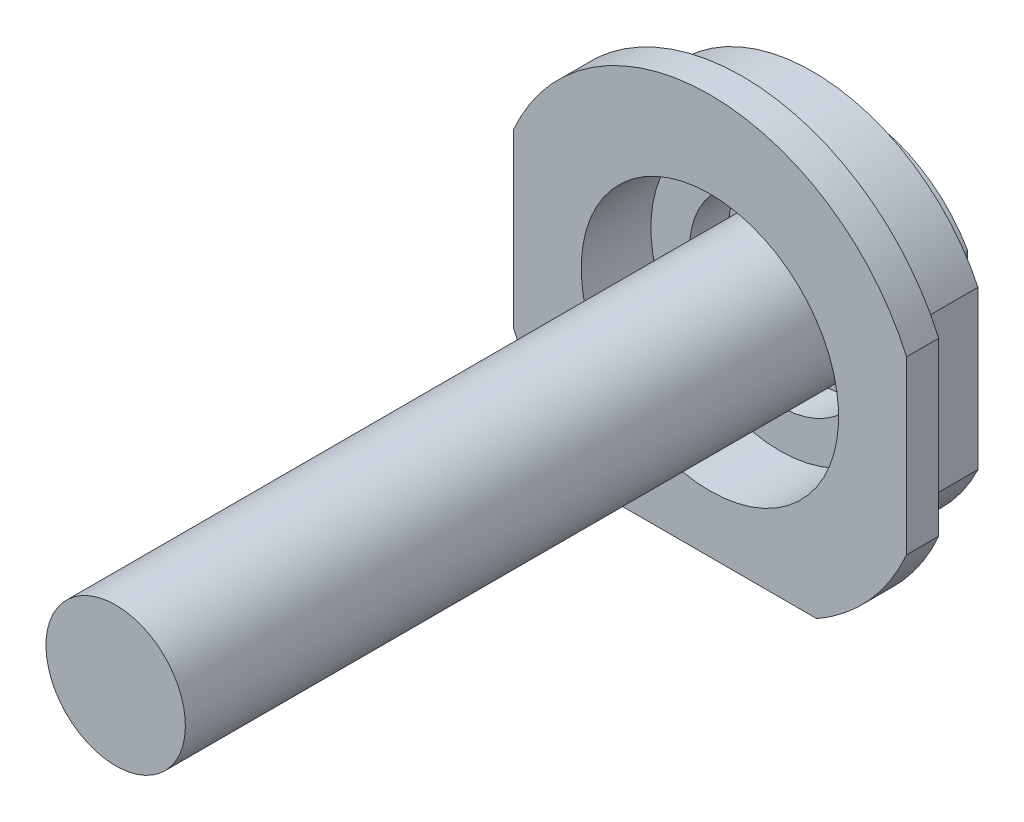
ISO-10303-21;
HEADER;
FILE_DESCRIPTION(('STEP AP214'),'2;1');
FILE_NAME('part.step','',(''),(''),'','','');
FILE_SCHEMA(('AUTOMOTIVE_DESIGN { 1 0 10303 214 1 1 1 1 }'));
ENDSEC;
DATA;
#1=APPLICATION_CONTEXT('core data for automotive mechanical design processes');
#2=APPLICATION_PROTOCOL_DEFINITION('international standard','automotive_design',2000,#1);
#3=PRODUCT_CONTEXT('',#1,'mechanical');
#4=PRODUCT('Part','Part','',(#3));
#5=PRODUCT_RELATED_PRODUCT_CATEGORY('part','',(#4));
#6=PRODUCT_DEFINITION_FORMATION('','',#4);
#7=PRODUCT_DEFINITION_CONTEXT('part definition',#1,'design');
#8=PRODUCT_DEFINITION('design','',#6,#7);
#9=PRODUCT_DEFINITION_SHAPE('','',#8);
#10=(LENGTH_UNIT() NAMED_UNIT(*) SI_UNIT(.MILLI.,.METRE.));
#11=(NAMED_UNIT(*) PLANE_ANGLE_UNIT() SI_UNIT($,.RADIAN.));
#12=(NAMED_UNIT(*) SI_UNIT($,.STERADIAN.) SOLID_ANGLE_UNIT());
#13=UNCERTAINTY_MEASURE_WITH_UNIT(LENGTH_MEASURE(1.E-05),#10,'distance_accuracy_value','');
#14=(GEOMETRIC_REPRESENTATION_CONTEXT(3) GLOBAL_UNCERTAINTY_ASSIGNED_CONTEXT((#13)) GLOBAL_UNIT_ASSIGNED_CONTEXT((#10,
#11,#12)) REPRESENTATION_CONTEXT('',''));
#15=CARTESIAN_POINT('',(0.,0.,0.));
#16=DIRECTION('',(0.,0.,1.));
#17=DIRECTION('',(1.,0.,0.));
#18=AXIS2_PLACEMENT_3D('',#15,#16,#17);
#19=CARTESIAN_POINT('',(620.2391212457,0.,514.5));
#20=DIRECTION('',(0.,0.,1.));
#21=DIRECTION('',(0.,1.,0.));
#22=AXIS2_PLACEMENT_3D('',#19,#20,#21);
#23=PLANE('',#22);
#24=CARTESIAN_POINT('',(625.,0.,514.499999999686));
#25=DIRECTION('',(0.,0.,1.));
#26=DIRECTION('',(0.,1.,0.));
#27=AXIS2_PLACEMENT_3D('',#24,#25,#26);
#28=CIRCLE('',#27,72.5);
#29=CARTESIAN_POINT('',(687.99999999966,35.8782664024179,514.499999999686));
#30=VERTEX_POINT('',#29);
#31=CARTESIAN_POINT('',(687.99999999966,-35.8782664024181,514.499999999686));
#32=VERTEX_POINT('',#31);
#33=EDGE_CURVE('E274',#30,#32,#28,.T.);
#34=ORIENTED_EDGE('',*,*,#33,.F.);
#35=DIRECTION('',(0.,1.,0.));
#36=VECTOR('',#35,1.);
#37=CARTESIAN_POINT('',(688.,-1.00475183728577E-11,514.5));
#38=LINE('',#37,#36);
#39=EDGE_CURVE('E270',#32,#30,#38,.T.);
#40=ORIENTED_EDGE('',*,*,#39,.F.);
#41=EDGE_LOOP('',(#34,#40));
#42=FACE_BOUND('',#41,.T.);
#43=CARTESIAN_POINT('',(625.,0.,514.499999999686));
#44=DIRECTION('',(0.,0.,1.));
#45=DIRECTION('',(0.,1.,0.));
#46=AXIS2_PLACEMENT_3D('',#43,#44,#45);
#47=CIRCLE('',#46,60.5);
#48=CARTESIAN_POINT('',(625.,60.4999999999999,514.499999999686));
#49=VERTEX_POINT('',#48);
#50=EDGE_CURVE('E11',#49,#49,#47,.F.);
#51=ORIENTED_EDGE('',*,*,#50,.F.);
#52=EDGE_LOOP('',(#51));
#53=FACE_BOUND('',#52,.T.);
#54=ADVANCED_FACE('F18',(#42,#53),#23,.F.);
#55=CARTESIAN_POINT('',(692.7975,-1.00475183728577E-11,520.866497531727));
#56=DIRECTION('',(-0.798635510047432,0.,0.601815023151864));
#57=DIRECTION('',(0.601815023151864,0.,0.798635510047432));
#58=AXIS2_PLACEMENT_3D('',#55,#56,#57);
#59=PLANE('',#58);
#60=ORIENTED_EDGE('',*,*,#39,.T.);
#61=CARTESIAN_POINT('',(625.,0.,430.896176238464));
#62=DIRECTION('',(-0.798635510047432,0.,0.601815023151864));
#63=DIRECTION('',(0.601815023151864,0.,0.798635510047432));
#64=AXIS2_PLACEMENT_3D('',#61,#62,#63);
#65=ELLIPSE('',#64,120.468910231417,72.5);
#66=EDGE_CURVE('E37',#30,#32,#65,.F.);
#67=ORIENTED_EDGE('',*,*,#66,.T.);
#68=EDGE_LOOP('',(#60,#67));
#69=FACE_BOUND('',#68,.T.);
#70=ADVANCED_FACE('F304',(#69),#59,.F.);
#71=CARTESIAN_POINT('',(624.999999998898,1.10211839654539E-09,-5999485.5));
#72=DIRECTION('',(0.,0.,1.));
#73=DIRECTION('',(0.,1.,0.));
#74=AXIS2_PLACEMENT_3D('',#71,#72,#73);
#75=CYLINDRICAL_SURFACE('',#74,72.5);
#76=ORIENTED_EDGE('',*,*,#66,.F.);
#77=ORIENTED_EDGE('',*,*,#33,.T.);
#78=EDGE_LOOP('',(#76,#77));
#79=FACE_BOUND('',#78,.T.);
#80=CARTESIAN_POINT('',(625.,0.,537.999999999926));
#81=DIRECTION('',(0.,0.,1.));
#82=DIRECTION('',(0.,1.,0.));
#83=AXIS2_PLACEMENT_3D('',#80,#81,#82);
#84=CIRCLE('',#83,72.5);
#85=CARTESIAN_POINT('',(625.,72.4999999999999,537.999999999926));
#86=VERTEX_POINT('',#85);
#87=EDGE_CURVE('E166',#86,#86,#84,.T.);
#88=ORIENTED_EDGE('',*,*,#87,.F.);
#89=EDGE_LOOP('',(#88));
#90=FACE_BOUND('',#89,.T.);
#91=ADVANCED_FACE('F298',(#79,#90),#75,.T.);
#92=CARTESIAN_POINT('',(625.,0.,534.5));
#93=DIRECTION('',(0.,0.,1.));
#94=DIRECTION('',(0.,1.,0.));
#95=AXIS2_PLACEMENT_3D('',#92,#93,#94);
#96=PLANE('',#95);
#97=CARTESIAN_POINT('',(625.,0.,534.500000000123));
#98=DIRECTION('',(0.,0.,1.));
#99=DIRECTION('',(0.,1.,0.));
#100=AXIS2_PLACEMENT_3D('',#97,#98,#99);
#101=CIRCLE('',#100,50.5);
#102=CARTESIAN_POINT('',(625.,50.5,534.500000000123));
#103=VERTEX_POINT('',#102);
#104=EDGE_CURVE('E281',#103,#103,#101,.F.);
#105=ORIENTED_EDGE('',*,*,#104,.F.);
#106=EDGE_LOOP('',(#105));
#107=FACE_BOUND('',#106,.T.);
#108=CARTESIAN_POINT('',(625.,0.,534.500000000123));
#109=DIRECTION('',(0.,0.,1.));
#110=DIRECTION('',(0.,1.,0.));
#111=AXIS2_PLACEMENT_3D('',#108,#109,#110);
#112=CIRCLE('',#111,43.25);
#113=CARTESIAN_POINT('',(625.,43.2499999999999,534.500000000123));
#114=VERTEX_POINT('',#113);
#115=EDGE_CURVE('E277',#114,#114,#112,.T.);
#116=ORIENTED_EDGE('',*,*,#115,.F.);
#117=EDGE_LOOP('',(#116));
#118=FACE_BOUND('',#117,.T.);
#119=ADVANCED_FACE('F294',(#107,#118),#96,.T.);
#120=CARTESIAN_POINT('',(624.999999998898,1.10210451875758E-09,-5999489.5));
#121=DIRECTION('',(0.,0.,1.));
#122=DIRECTION('',(0.,1.,0.));
#123=AXIS2_PLACEMENT_3D('',#120,#121,#122);
#124=CYLINDRICAL_SURFACE('',#123,43.25);
#125=CARTESIAN_POINT('',(625.,0.,515.49999999989));
#126=DIRECTION('',(0.,0.,1.));
#127=DIRECTION('',(0.,1.,0.));
#128=AXIS2_PLACEMENT_3D('',#125,#126,#127);
#129=CIRCLE('',#128,43.25);
#130=CARTESIAN_POINT('',(625.,43.2499999999999,515.49999999989));
#131=VERTEX_POINT('',#130);
#132=EDGE_CURVE('E28',#131,#131,#129,.T.);
#133=ORIENTED_EDGE('',*,*,#132,.F.);
#134=EDGE_LOOP('',(#133));
#135=FACE_BOUND('',#134,.T.);
#136=ORIENTED_EDGE('',*,*,#115,.T.);
#137=EDGE_LOOP('',(#136));
#138=FACE_BOUND('',#137,.T.);
#139=ADVANCED_FACE('F20',(#135,#138),#124,.F.);
#140=CARTESIAN_POINT('',(625.000000001102,-1.10222941884785E-09,6000577.5));
#141=DIRECTION('',(0.,0.,-1.));
#142=DIRECTION('',(0.,-1.,0.));
#143=AXIS2_PLACEMENT_3D('',#140,#141,#142);
#144=CYLINDRICAL_SURFACE('',#143,102.5);
#145=DIRECTION('',(0.,0.,-1.));
#146=VECTOR('',#145,1.);
#147=CARTESIAN_POINT('',(532.5,-44.1588043316391,577.5));
#148=LINE('',#147,#146);
#149=CARTESIAN_POINT('',(532.5,-44.1588043316391,577.499999999894));
#150=VERTEX_POINT('',#149);
#151=CARTESIAN_POINT('',(532.5,-44.1588043316396,537.999999999963));
#152=VERTEX_POINT('',#151);
#153=EDGE_CURVE('E150',#150,#152,#148,.T.);
#154=ORIENTED_EDGE('',*,*,#153,.T.);
#155=CARTESIAN_POINT('',(625.,0.,537.999999999926));
#156=DIRECTION('',(0.,0.,1.));
#157=DIRECTION('',(0.,1.,0.));
#158=AXIS2_PLACEMENT_3D('',#155,#156,#157);
#159=CIRCLE('',#158,102.5);
#160=CARTESIAN_POINT('',(717.5,-44.1588043316397,537.999999999945));
#161=VERTEX_POINT('',#160);
#162=EDGE_CURVE('E143',#161,#152,#159,.F.);
#163=ORIENTED_EDGE('',*,*,#162,.F.);
#164=DIRECTION('',(0.,0.,-1.));
#165=VECTOR('',#164,1.);
#166=CARTESIAN_POINT('',(717.5,-44.1588043316392,556.5));
#167=LINE('',#166,#165);
#168=CARTESIAN_POINT('',(717.5,-44.1588043316392,577.499999999894));
#169=VERTEX_POINT('',#168);
#170=EDGE_CURVE('E125',#161,#169,#167,.F.);
#171=ORIENTED_EDGE('',*,*,#170,.T.);
#172=CARTESIAN_POINT('',(625.,0.,577.499999999788));
#173=DIRECTION('',(0.,0.,-1.));
#174=DIRECTION('',(0.,-1.,0.));
#175=AXIS2_PLACEMENT_3D('',#172,#173,#174);
#176=CIRCLE('',#175,102.5);
#177=EDGE_CURVE('E188',#150,#169,#176,.F.);
#178=ORIENTED_EDGE('',*,*,#177,.F.);
#179=EDGE_LOOP('',(#154,#163,#171,#178));
#180=FACE_BOUND('',#179,.T.);
#181=ADVANCED_FACE('F149',(#180),#144,.T.);
#182=CARTESIAN_POINT('',(532.5,-2.00395255944841E-11,567.));
#183=DIRECTION('',(1.,0.,0.));
#184=DIRECTION('',(0.,1.,0.));
#185=AXIS2_PLACEMENT_3D('',#182,#183,#184);
#186=PLANE('',#185);
#187=DIRECTION('',(0.,-1.,0.));
#188=VECTOR('',#187,1.);
#189=CARTESIAN_POINT('',(532.5,9.12000000686793,577.5));
#190=LINE('',#189,#188);
#191=CARTESIAN_POINT('',(532.5,44.1588043316586,577.499999999894));
#192=VERTEX_POINT('',#191);
#193=EDGE_CURVE('E184',#192,#150,#190,.T.);
#194=ORIENTED_EDGE('',*,*,#193,.F.);
#195=DIRECTION('',(0.,0.,1.));
#196=VECTOR('',#195,1.);
#197=CARTESIAN_POINT('',(532.5,44.1588043316782,567.));
#198=LINE('',#197,#196);
#199=CARTESIAN_POINT('',(532.5,44.1588043316232,537.999999999963));
#200=VERTEX_POINT('',#199);
#201=EDGE_CURVE('E136',#192,#200,#198,.F.);
#202=ORIENTED_EDGE('',*,*,#201,.T.);
#203=DIRECTION('',(0.,-1.,0.));
#204=VECTOR('',#203,1.);
#205=CARTESIAN_POINT('',(532.5,-2.00395255944841E-11,538.));
#206=LINE('',#205,#204);
#207=EDGE_CURVE('E163',#200,#152,#206,.T.);
#208=ORIENTED_EDGE('',*,*,#207,.T.);
#209=ORIENTED_EDGE('',*,*,#153,.F.);
#210=EDGE_LOOP('',(#194,#202,#208,#209));
#211=FACE_BOUND('',#210,.T.);
#212=ADVANCED_FACE('F357',(#211),#186,.F.);
#213=CARTESIAN_POINT('',(625.000000001102,-1.10222941884785E-09,6000577.5));
#214=DIRECTION('',(0.,0.,-1.));
#215=DIRECTION('',(0.,-1.,0.));
#216=AXIS2_PLACEMENT_3D('',#213,#214,#215);
#217=CYLINDRICAL_SURFACE('',#216,102.5);
#218=ORIENTED_EDGE('',*,*,#201,.F.);
#219=CARTESIAN_POINT('',(625.,0.,577.499999999788));
#220=DIRECTION('',(0.,0.,-1.));
#221=DIRECTION('',(0.,-1.,0.));
#222=AXIS2_PLACEMENT_3D('',#219,#220,#221);
#223=CIRCLE('',#222,102.5);
#224=CARTESIAN_POINT('',(717.5,44.1588043316391,577.499999999894));
#225=VERTEX_POINT('',#224);
#226=EDGE_CURVE('E187',#225,#192,#223,.F.);
#227=ORIENTED_EDGE('',*,*,#226,.F.);
#228=DIRECTION('',(0.,0.,-1.));
#229=VECTOR('',#228,1.);
#230=CARTESIAN_POINT('',(717.5,44.1588043316391,577.5));
#231=LINE('',#230,#229);
#232=CARTESIAN_POINT('',(717.5,44.1588043316492,537.999999999963));
#233=VERTEX_POINT('',#232);
#234=EDGE_CURVE('E135',#225,#233,#231,.T.);
#235=ORIENTED_EDGE('',*,*,#234,.T.);
#236=CARTESIAN_POINT('',(625.,0.,537.999999999926));
#237=DIRECTION('',(0.,0.,1.));
#238=DIRECTION('',(0.,1.,0.));
#239=AXIS2_PLACEMENT_3D('',#236,#237,#238);
#240=CIRCLE('',#239,102.5);
#241=EDGE_CURVE('E146',#200,#233,#240,.F.);
#242=ORIENTED_EDGE('',*,*,#241,.F.);
#243=EDGE_LOOP('',(#218,#227,#235,#242));
#244=FACE_BOUND('',#243,.T.);
#245=ADVANCED_FACE('F354',(#244),#217,.T.);
#246=CARTESIAN_POINT('',(717.5,-2.00811589579075E-11,567.));
#247=DIRECTION('',(-1.,0.,0.));
#248=DIRECTION('',(0.,-1.,0.));
#249=AXIS2_PLACEMENT_3D('',#246,#247,#248);
#250=PLANE('',#249);
#251=DIRECTION('',(0.,-1.,0.));
#252=VECTOR('',#251,1.);
#253=CARTESIAN_POINT('',(717.5,9.12000000686791,577.5));
#254=LINE('',#253,#252);
#255=EDGE_CURVE('E130',#169,#225,#254,.F.);
#256=ORIENTED_EDGE('',*,*,#255,.F.);
#257=ORIENTED_EDGE('',*,*,#170,.F.);
#258=DIRECTION('',(0.,1.,0.));
#259=VECTOR('',#258,1.);
#260=CARTESIAN_POINT('',(717.5,0.000224821004951581,538.));
#261=LINE('',#260,#259);
#262=EDGE_CURVE('E128',#233,#161,#261,.F.);
#263=ORIENTED_EDGE('',*,*,#262,.F.);
#264=ORIENTED_EDGE('',*,*,#234,.F.);
#265=EDGE_LOOP('',(#256,#257,#263,#264));
#266=FACE_BOUND('',#265,.T.);
#267=ADVANCED_FACE('F127',(#266),#250,.F.);
#268=CARTESIAN_POINT('',(625.,9.12000000686791,577.5));
#269=DIRECTION('',(0.,0.,-1.));
#270=DIRECTION('',(0.,-1.,0.));
#271=AXIS2_PLACEMENT_3D('',#268,#269,#270);
#272=PLANE('',#271);
#273=ORIENTED_EDGE('',*,*,#255,.T.);
#274=ORIENTED_EDGE('',*,*,#226,.T.);
#275=ORIENTED_EDGE('',*,*,#193,.T.);
#276=ORIENTED_EDGE('',*,*,#177,.T.);
#277=EDGE_LOOP('',(#273,#274,#275,#276));
#278=FACE_BOUND('',#277,.T.);
#279=CARTESIAN_POINT('',(625.,0.,577.499999999788));
#280=DIRECTION('',(0.,0.,-1.));
#281=DIRECTION('',(0.,-1.,0.));
#282=AXIS2_PLACEMENT_3D('',#279,#280,#281);
#283=CIRCLE('',#282,120.);
#284=CARTESIAN_POINT('',(515.,47.9583152331157,577.499999999894));
#285=VERTEX_POINT('',#284);
#286=CARTESIAN_POINT('',(735.,47.9583152331158,577.499999999894));
#287=VERTEX_POINT('',#286);
#288=EDGE_CURVE('E233',#285,#287,#283,.T.);
#289=ORIENTED_EDGE('',*,*,#288,.T.);
#290=DIRECTION('',(0.,1.,0.));
#291=VECTOR('',#290,1.);
#292=CARTESIAN_POINT('',(735.,-1.50712775592865E-11,577.5));
#293=LINE('',#292,#291);
#294=CARTESIAN_POINT('',(735.,-47.9583152331286,577.499999999894));
#295=VERTEX_POINT('',#294);
#296=EDGE_CURVE('E192',#295,#287,#293,.T.);
#297=ORIENTED_EDGE('',*,*,#296,.F.);
#298=CARTESIAN_POINT('',(625.,0.,577.499999999788));
#299=DIRECTION('',(0.,0.,-1.));
#300=DIRECTION('',(0.,-1.,0.));
#301=AXIS2_PLACEMENT_3D('',#298,#299,#300);
#302=CIRCLE('',#301,120.);
#303=CARTESIAN_POINT('',(684.866518188382,-104.,577.499999999841));
#304=VERTEX_POINT('',#303);
#305=EDGE_CURVE('E201',#295,#304,#302,.T.);
#306=ORIENTED_EDGE('',*,*,#305,.T.);
#307=DIRECTION('',(-1.,0.,0.));
#308=VECTOR('',#307,1.);
#309=CARTESIAN_POINT('',(625.,-104.,577.5));
#310=LINE('',#309,#308);
#311=CARTESIAN_POINT('',(565.13348181163,-104.,577.499999999894));
#312=VERTEX_POINT('',#311);
#313=EDGE_CURVE('E208',#304,#312,#310,.T.);
#314=ORIENTED_EDGE('',*,*,#313,.T.);
#315=CARTESIAN_POINT('',(625.,0.,577.499999999788));
#316=DIRECTION('',(0.,0.,-1.));
#317=DIRECTION('',(0.,-1.,0.));
#318=AXIS2_PLACEMENT_3D('',#315,#316,#317);
#319=CIRCLE('',#318,120.);
#320=CARTESIAN_POINT('',(515.,-47.9583152331285,577.499999999841));
#321=VERTEX_POINT('',#320);
#322=EDGE_CURVE('E218',#312,#321,#319,.T.);
#323=ORIENTED_EDGE('',*,*,#322,.T.);
#324=DIRECTION('',(0.,-1.,0.));
#325=VECTOR('',#324,1.);
#326=CARTESIAN_POINT('',(515.,9.12000000686793,577.5));
#327=LINE('',#326,#325);
#328=EDGE_CURVE('E222',#321,#285,#327,.F.);
#329=ORIENTED_EDGE('',*,*,#328,.T.);
#330=EDGE_LOOP('',(#289,#297,#306,#314,#323,#329));
#331=FACE_BOUND('',#330,.T.);
#332=ADVANCED_FACE('F347',(#278,#331),#272,.T.);
#333=CARTESIAN_POINT('',(735.,-1.50712775592865E-11,586.5));
#334=DIRECTION('',(1.,0.,0.));
#335=DIRECTION('',(0.,1.,0.));
#336=AXIS2_PLACEMENT_3D('',#333,#334,#335);
#337=PLANE('',#336);
#338=DIRECTION('',(0.,0.,1.));
#339=VECTOR('',#338,1.);
#340=CARTESIAN_POINT('',(735.,47.9583152331043,586.5));
#341=LINE('',#340,#339);
#342=CARTESIAN_POINT('',(735.,47.9583152331158,595.499999999909));
#343=VERTEX_POINT('',#342);
#344=EDGE_CURVE('E225',#287,#343,#341,.T.);
#345=ORIENTED_EDGE('',*,*,#344,.T.);
#346=DIRECTION('',(0.,1.,0.));
#347=VECTOR('',#346,1.);
#348=CARTESIAN_POINT('',(735.,-1.50712775592865E-11,595.5));
#349=LINE('',#348,#347);
#350=CARTESIAN_POINT('',(735.,-47.9583152331286,595.499999999909));
#351=VERTEX_POINT('',#350);
#352=EDGE_CURVE('E240',#343,#351,#349,.F.);
#353=ORIENTED_EDGE('',*,*,#352,.T.);
#354=DIRECTION('',(0.,0.,1.));
#355=VECTOR('',#354,1.);
#356=CARTESIAN_POINT('',(735.,-47.9583152331297,586.5));
#357=LINE('',#356,#355);
#358=EDGE_CURVE('E200',#351,#295,#357,.F.);
#359=ORIENTED_EDGE('',*,*,#358,.T.);
#360=ORIENTED_EDGE('',*,*,#296,.T.);
#361=EDGE_LOOP('',(#345,#353,#359,#360));
#362=FACE_BOUND('',#361,.T.);
#363=ADVANCED_FACE('F343',(#362),#337,.T.);
#364=CARTESIAN_POINT('',(625.000000001102,-1.10225717442347E-09,6000595.5));
#365=DIRECTION('',(0.,0.,-1.));
#366=DIRECTION('',(0.,-1.,0.));
#367=AXIS2_PLACEMENT_3D('',#364,#365,#366);
#368=CYLINDRICAL_SURFACE('',#367,120.);
#369=DIRECTION('',(0.,0.,-1.));
#370=VECTOR('',#369,1.);
#371=CARTESIAN_POINT('',(684.866518189483,-104.000000001104,6000595.5));
#372=LINE('',#371,#370);
#373=CARTESIAN_POINT('',(684.866518188382,-104.,595.499999999863));
#374=VERTEX_POINT('',#373);
#375=EDGE_CURVE('E204',#374,#304,#372,.T.);
#376=ORIENTED_EDGE('',*,*,#375,.T.);
#377=ORIENTED_EDGE('',*,*,#305,.F.);
#378=ORIENTED_EDGE('',*,*,#358,.F.);
#379=CARTESIAN_POINT('',(625.,0.,595.499999999817));
#380=DIRECTION('',(0.,0.,-1.));
#381=DIRECTION('',(0.,-1.,0.));
#382=AXIS2_PLACEMENT_3D('',#379,#380,#381);
#383=CIRCLE('',#382,120.);
#384=EDGE_CURVE('E258',#351,#374,#383,.T.);
#385=ORIENTED_EDGE('',*,*,#384,.T.);
#386=EDGE_LOOP('',(#376,#377,#378,#385));
#387=FACE_BOUND('',#386,.T.);
#388=ADVANCED_FACE('F339',(#387),#368,.T.);
#389=CARTESIAN_POINT('',(624.99999999999,-104.,586.5));
#390=DIRECTION('',(0.,1.,0.));
#391=DIRECTION('',(-1.,0.,0.));
#392=AXIS2_PLACEMENT_3D('',#389,#390,#391);
#393=PLANE('',#392);
#394=ORIENTED_EDGE('',*,*,#313,.F.);
#395=ORIENTED_EDGE('',*,*,#375,.F.);
#396=DIRECTION('',(-1.,0.,0.));
#397=VECTOR('',#396,1.);
#398=CARTESIAN_POINT('',(624.99999999999,-104.,595.5));
#399=LINE('',#398,#397);
#400=CARTESIAN_POINT('',(565.13348181163,-104.,595.499999999909));
#401=VERTEX_POINT('',#400);
#402=EDGE_CURVE('E254',#374,#401,#399,.T.);
#403=ORIENTED_EDGE('',*,*,#402,.T.);
#404=DIRECTION('',(0.,0.,1.));
#405=VECTOR('',#404,1.);
#406=CARTESIAN_POINT('',(565.133481811644,-104.,586.5));
#407=LINE('',#406,#405);
#408=EDGE_CURVE('E211',#401,#312,#407,.F.);
#409=ORIENTED_EDGE('',*,*,#408,.T.);
#410=EDGE_LOOP('',(#394,#395,#403,#409));
#411=FACE_BOUND('',#410,.T.);
#412=ADVANCED_FACE('F335',(#411),#393,.F.);
#413=CARTESIAN_POINT('',(625.000000001102,-1.10225717442347E-09,6000595.5));
#414=DIRECTION('',(0.,0.,-1.));
#415=DIRECTION('',(0.,-1.,0.));
#416=AXIS2_PLACEMENT_3D('',#413,#414,#415);
#417=CYLINDRICAL_SURFACE('',#416,120.);
#418=ORIENTED_EDGE('',*,*,#408,.F.);
#419=CARTESIAN_POINT('',(625.,0.,595.499999999817));
#420=DIRECTION('',(0.,0.,-1.));
#421=DIRECTION('',(0.,-1.,0.));
#422=AXIS2_PLACEMENT_3D('',#419,#420,#421);
#423=CIRCLE('',#422,120.);
#424=CARTESIAN_POINT('',(515.,-47.9583152331285,595.499999999863));
#425=VERTEX_POINT('',#424);
#426=EDGE_CURVE('E250',#401,#425,#423,.T.);
#427=ORIENTED_EDGE('',*,*,#426,.T.);
#428=DIRECTION('',(0.,0.,-1.));
#429=VECTOR('',#428,1.);
#430=CARTESIAN_POINT('',(515.000000001103,-47.9583152342318,6000595.5));
#431=LINE('',#430,#429);
#432=EDGE_CURVE('E221',#425,#321,#431,.T.);
#433=ORIENTED_EDGE('',*,*,#432,.T.);
#434=ORIENTED_EDGE('',*,*,#322,.F.);
#435=EDGE_LOOP('',(#418,#427,#433,#434));
#436=FACE_BOUND('',#435,.T.);
#437=ADVANCED_FACE('F331',(#436),#417,.T.);
#438=CARTESIAN_POINT('',(515.,-1.50573997714787E-11,586.5));
#439=DIRECTION('',(1.,0.,0.));
#440=DIRECTION('',(0.,1.,0.));
#441=AXIS2_PLACEMENT_3D('',#438,#439,#440);
#442=PLANE('',#441);
#443=ORIENTED_EDGE('',*,*,#328,.F.);
#444=ORIENTED_EDGE('',*,*,#432,.F.);
#445=DIRECTION('',(0.,1.,0.));
#446=VECTOR('',#445,1.);
#447=CARTESIAN_POINT('',(515.,-1.50573997714787E-11,595.5));
#448=LINE('',#447,#446);
#449=CARTESIAN_POINT('',(515.,47.9583152331157,595.499999999909));
#450=VERTEX_POINT('',#449);
#451=EDGE_CURVE('E246',#425,#450,#448,.T.);
#452=ORIENTED_EDGE('',*,*,#451,.T.);
#453=DIRECTION('',(0.,0.,1.));
#454=VECTOR('',#453,1.);
#455=CARTESIAN_POINT('',(515.,47.9583152331043,586.5));
#456=LINE('',#455,#454);
#457=EDGE_CURVE('E229',#450,#285,#456,.F.);
#458=ORIENTED_EDGE('',*,*,#457,.T.);
#459=EDGE_LOOP('',(#443,#444,#452,#458));
#460=FACE_BOUND('',#459,.T.);
#461=ADVANCED_FACE('F327',(#460),#442,.F.);
#462=CARTESIAN_POINT('',(625.000000001102,-1.10225717442347E-09,6000595.5));
#463=DIRECTION('',(0.,0.,-1.));
#464=DIRECTION('',(0.,-1.,0.));
#465=AXIS2_PLACEMENT_3D('',#462,#463,#464);
#466=CYLINDRICAL_SURFACE('',#465,120.);
#467=ORIENTED_EDGE('',*,*,#457,.F.);
#468=CARTESIAN_POINT('',(625.,0.,595.499999999817));
#469=DIRECTION('',(0.,0.,-1.));
#470=DIRECTION('',(0.,-1.,0.));
#471=AXIS2_PLACEMENT_3D('',#468,#469,#470);
#472=CIRCLE('',#471,120.);
#473=EDGE_CURVE('E245',#450,#343,#472,.T.);
#474=ORIENTED_EDGE('',*,*,#473,.T.);
#475=ORIENTED_EDGE('',*,*,#344,.F.);
#476=ORIENTED_EDGE('',*,*,#288,.F.);
#477=EDGE_LOOP('',(#467,#474,#475,#476));
#478=FACE_BOUND('',#477,.T.);
#479=ADVANCED_FACE('F323',(#478),#466,.T.);
#480=CARTESIAN_POINT('',(625.000000001102,-1.10224329663566E-09,6000595.5));
#481=DIRECTION('',(0.,0.,-1.));
#482=DIRECTION('',(0.,-1.,0.));
#483=AXIS2_PLACEMENT_3D('',#480,#481,#482);
#484=CYLINDRICAL_SURFACE('',#483,72.);
#485=CARTESIAN_POINT('',(625.,0.,556.500000000057));
#486=DIRECTION('',(0.,0.,1.));
#487=DIRECTION('',(0.,1.,0.));
#488=AXIS2_PLACEMENT_3D('',#485,#486,#487);
#489=CIRCLE('',#488,72.);
#490=CARTESIAN_POINT('',(625.,71.9999999999999,556.500000000057));
#491=VERTEX_POINT('',#490);
#492=EDGE_CURVE('E174',#491,#491,#489,.T.);
#493=ORIENTED_EDGE('',*,*,#492,.F.);
#494=EDGE_LOOP('',(#493));
#495=FACE_BOUND('',#494,.T.);
#496=CARTESIAN_POINT('',(625.,0.,595.499999999817));
#497=DIRECTION('',(0.,0.,-1.));
#498=DIRECTION('',(0.,-1.,0.));
#499=AXIS2_PLACEMENT_3D('',#496,#497,#498);
#500=CIRCLE('',#499,72.);
#501=CARTESIAN_POINT('',(625.,-72.0000000000001,595.499999999817));
#502=VERTEX_POINT('',#501);
#503=EDGE_CURVE('E241',#502,#502,#500,.F.);
#504=ORIENTED_EDGE('',*,*,#503,.T.);
#505=EDGE_LOOP('',(#504));
#506=FACE_BOUND('',#505,.T.);
#507=ADVANCED_FACE('F319',(#495,#506),#484,.F.);
#508=CARTESIAN_POINT('',(625.,9.12000000666593,595.5));
#509=DIRECTION('',(0.,0.,-1.));
#510=DIRECTION('',(0.,-1.,0.));
#511=AXIS2_PLACEMENT_3D('',#508,#509,#510);
#512=PLANE('',#511);
#513=ORIENTED_EDGE('',*,*,#503,.F.);
#514=EDGE_LOOP('',(#513));
#515=FACE_BOUND('',#514,.T.);
#516=ORIENTED_EDGE('',*,*,#451,.F.);
#517=ORIENTED_EDGE('',*,*,#426,.F.);
#518=ORIENTED_EDGE('',*,*,#402,.F.);
#519=ORIENTED_EDGE('',*,*,#384,.F.);
#520=ORIENTED_EDGE('',*,*,#352,.F.);
#521=ORIENTED_EDGE('',*,*,#473,.F.);
#522=EDGE_LOOP('',(#516,#517,#518,#519,#520,#521));
#523=FACE_BOUND('',#522,.T.);
#524=ADVANCED_FACE('F314',(#515,#523),#512,.F.);
#525=CARTESIAN_POINT('',(625.,0.000224821004951581,538.));
#526=DIRECTION('',(0.,0.,1.));
#527=DIRECTION('',(0.,1.,0.));
#528=AXIS2_PLACEMENT_3D('',#525,#526,#527);
#529=PLANE('',#528);
#530=ORIENTED_EDGE('',*,*,#87,.T.);
#531=EDGE_LOOP('',(#530));
#532=FACE_BOUND('',#531,.T.);
#533=ORIENTED_EDGE('',*,*,#262,.T.);
#534=ORIENTED_EDGE('',*,*,#162,.T.);
#535=ORIENTED_EDGE('',*,*,#207,.F.);
#536=ORIENTED_EDGE('',*,*,#241,.T.);
#537=EDGE_LOOP('',(#533,#534,#535,#536));
#538=FACE_BOUND('',#537,.T.);
#539=ADVANCED_FACE('F141',(#532,#538),#529,.F.);
#540=CARTESIAN_POINT('',(625.,0.000224821004937703,556.5));
#541=DIRECTION('',(0.,0.,1.));
#542=DIRECTION('',(0.,1.,0.));
#543=AXIS2_PLACEMENT_3D('',#540,#541,#542);
#544=PLANE('',#543);
#545=ORIENTED_EDGE('',*,*,#492,.T.);
#546=EDGE_LOOP('',(#545));
#547=FACE_BOUND('',#546,.T.);
#548=CARTESIAN_POINT('',(625.,0.,556.500000000057));
#549=DIRECTION('',(0.,0.,1.));
#550=DIRECTION('',(0.,1.,0.));
#551=AXIS2_PLACEMENT_3D('',#548,#549,#550);
#552=CIRCLE('',#551,50.5);
#553=CARTESIAN_POINT('',(625.,50.4999999999999,556.500000000057));
#554=VERTEX_POINT('',#553);
#555=EDGE_CURVE('E170',#554,#554,#552,.T.);
#556=ORIENTED_EDGE('',*,*,#555,.F.);
#557=EDGE_LOOP('',(#556));
#558=FACE_BOUND('',#557,.T.);
#559=ADVANCED_FACE('F368',(#547,#558),#544,.T.);
#560=CARTESIAN_POINT('',(624.999999998898,1.10211839654539E-09,-5999465.5));
#561=DIRECTION('',(0.,0.,1.));
#562=DIRECTION('',(0.,1.,0.));
#563=AXIS2_PLACEMENT_3D('',#560,#561,#562);
#564=CYLINDRICAL_SURFACE('',#563,50.5);
#565=ORIENTED_EDGE('',*,*,#104,.T.);
#566=EDGE_LOOP('',(#565));
#567=FACE_BOUND('',#566,.T.);
#568=ORIENTED_EDGE('',*,*,#555,.T.);
#569=EDGE_LOOP('',(#568));
#570=FACE_BOUND('',#569,.T.);
#571=ADVANCED_FACE('F364',(#567,#570),#564,.F.);
#572=CARTESIAN_POINT('',(625.00000000002,-1.38777878078145E-13,928.));
#573=DIRECTION('',(0.,0.,1.));
#574=DIRECTION('',(0.,1.,0.));
#575=AXIS2_PLACEMENT_3D('',#572,#573,#574);
#576=PLANE('',#575);
#577=CARTESIAN_POINT('',(625.,-1.38777878078145E-13,928.000000000254));
#578=DIRECTION('',(0.,0.,1.));
#579=DIRECTION('',(0.,1.,0.));
#580=AXIS2_PLACEMENT_3D('',#577,#578,#579);
#581=CIRCLE('',#580,39.);
#582=CARTESIAN_POINT('',(625.,38.9999999999999,928.000000000254));
#583=VERTEX_POINT('',#582);
#584=EDGE_CURVE('E157',#583,#583,#581,.T.);
#585=ORIENTED_EDGE('',*,*,#584,.T.);
#586=EDGE_LOOP('',(#585));
#587=FACE_BOUND('',#586,.T.);
#588=ADVANCED_FACE('F367',(#587),#576,.T.);
#589=CARTESIAN_POINT('',(624.999999998898,1.10210451875758E-09,-5999498.));
#590=DIRECTION('',(0.,0.,1.));
#591=DIRECTION('',(0.,1.,0.));
#592=AXIS2_PLACEMENT_3D('',#589,#590,#591);
#593=CYLINDRICAL_SURFACE('',#592,39.);
#594=CARTESIAN_POINT('',(625.,0.,515.49999999989));
#595=DIRECTION('',(0.,0.,1.));
#596=DIRECTION('',(0.,1.,0.));
#597=AXIS2_PLACEMENT_3D('',#594,#595,#596);
#598=CIRCLE('',#597,39.);
#599=CARTESIAN_POINT('',(625.,38.9999999999999,515.49999999989));
#600=VERTEX_POINT('',#599);
#601=EDGE_CURVE('E688',#600,#600,#598,.T.);
#602=ORIENTED_EDGE('',*,*,#601,.T.);
#603=EDGE_LOOP('',(#602));
#604=FACE_BOUND('',#603,.T.);
#605=ORIENTED_EDGE('',*,*,#584,.F.);
#606=EDGE_LOOP('',(#605));
#607=FACE_BOUND('',#606,.T.);
#608=ADVANCED_FACE('F378',(#604,#607),#593,.T.);
#609=CARTESIAN_POINT('',(625.,0.,515.5));
#610=DIRECTION('',(0.,0.,1.));
#611=DIRECTION('',(0.,1.,0.));
#612=AXIS2_PLACEMENT_3D('',#609,#610,#611);
#613=PLANE('',#612);
#614=ORIENTED_EDGE('',*,*,#132,.T.);
#615=EDGE_LOOP('',(#614));
#616=FACE_BOUND('',#615,.T.);
#617=ORIENTED_EDGE('',*,*,#601,.F.);
#618=EDGE_LOOP('',(#617));
#619=FACE_BOUND('',#618,.T.);
#620=ADVANCED_FACE('F289',(#616,#619),#613,.T.);
#621=CARTESIAN_POINT('',(624.999999998898,1.10211839654539E-09,-5999492.));
#622=DIRECTION('',(0.,0.,1.));
#623=DIRECTION('',(0.,1.,0.));
#624=AXIS2_PLACEMENT_3D('',#621,#622,#623);
#625=CYLINDRICAL_SURFACE('',#624,60.5);
#626=CARTESIAN_POINT('',(625.,0.,508.000000000181));
#627=DIRECTION('',(0.,0.,1.));
#628=DIRECTION('',(0.,1.,0.));
#629=AXIS2_PLACEMENT_3D('',#626,#627,#628);
#630=CIRCLE('',#629,60.5);
#631=CARTESIAN_POINT('',(625.,60.4999999999999,508.000000000181));
#632=VERTEX_POINT('',#631);
#633=EDGE_CURVE('E685',#632,#632,#630,.T.);
#634=ORIENTED_EDGE('',*,*,#633,.T.);
#635=EDGE_LOOP('',(#634));
#636=FACE_BOUND('',#635,.T.);
#637=ORIENTED_EDGE('',*,*,#50,.T.);
#638=EDGE_LOOP('',(#637));
#639=FACE_BOUND('',#638,.T.);
#640=ADVANCED_FACE('F408',(#636,#639),#625,.T.);
#641=CARTESIAN_POINT('',(625.,0.,501.999999999868));
#642=DIRECTION('',(0.,0.,1.));
#643=DIRECTION('',(0.,1.,0.));
#644=AXIS2_PLACEMENT_3D('',#641,#642,#643);
#645=CIRCLE('',#644,39.);
#646=CARTESIAN_POINT('',(625.,38.9999999999999,501.999999999868));
#647=VERTEX_POINT('',#646);
#648=EDGE_CURVE('E680',#647,#647,#645,.F.);
#649=ORIENTED_EDGE('',*,*,#648,.F.);
#650=EDGE_LOOP('',(#649));
#651=FACE_BOUND('',#650,.T.);
#652=CARTESIAN_POINT('',(625.,0.,508.000000000181));
#653=DIRECTION('',(0.,0.,1.));
#654=DIRECTION('',(0.,1.,0.));
#655=AXIS2_PLACEMENT_3D('',#652,#653,#654);
#656=CIRCLE('',#655,39.);
#657=CARTESIAN_POINT('',(625.,38.9999999999999,508.000000000181));
#658=VERTEX_POINT('',#657);
#659=EDGE_CURVE('E152',#658,#658,#656,.T.);
#660=ORIENTED_EDGE('',*,*,#659,.F.);
#661=EDGE_LOOP('',(#660));
#662=FACE_BOUND('',#661,.T.);
#663=ADVANCED_FACE('F383',(#651,#662),#593,.T.);
#664=CARTESIAN_POINT('',(625.,0.,673.));
#665=DIRECTION('',(0.,0.,1.));
#666=DIRECTION('',(0.,1.,0.));
#667=AXIS2_PLACEMENT_3D('',#664,#665,#666);
#668=PLANE('',#667);
#669=CARTESIAN_POINT('',(625.,0.,673.000000000145));
#670=DIRECTION('',(0.,0.,1.));
#671=DIRECTION('',(0.,1.,0.));
#672=AXIS2_PLACEMENT_3D('',#669,#670,#671);
#673=CIRCLE('',#672,12.);
#674=CARTESIAN_POINT('',(625.,11.9999999999999,673.000000000145));
#675=VERTEX_POINT('',#674);
#676=EDGE_CURVE('E687',#675,#675,#673,.T.);
#677=ORIENTED_EDGE('',*,*,#676,.F.);
#678=EDGE_LOOP('',(#677));
#679=FACE_BOUND('',#678,.T.);
#680=ADVANCED_FACE('F400',(#679),#668,.F.);
#681=CARTESIAN_POINT('',(624.999999998898,1.10211839654539E-09,-5999501.));
#682=DIRECTION('',(0.,0.,1.));
#683=DIRECTION('',(0.,1.,0.));
#684=AXIS2_PLACEMENT_3D('',#681,#682,#683);
#685=CYLINDRICAL_SURFACE('',#684,12.);
#686=ORIENTED_EDGE('',*,*,#676,.T.);
#687=EDGE_LOOP('',(#686));
#688=FACE_BOUND('',#687,.T.);
#689=CARTESIAN_POINT('',(625.,0.,499.000000000166));
#690=DIRECTION('',(0.,0.,1.));
#691=DIRECTION('',(0.,1.,0.));
#692=AXIS2_PLACEMENT_3D('',#689,#690,#691);
#693=CIRCLE('',#692,12.);
#694=CARTESIAN_POINT('',(625.,11.9999999999999,499.000000000166));
#695=VERTEX_POINT('',#694);
#696=EDGE_CURVE('E693',#695,#695,#693,.F.);
#697=ORIENTED_EDGE('',*,*,#696,.T.);
#698=EDGE_LOOP('',(#697));
#699=FACE_BOUND('',#698,.T.);
#700=ADVANCED_FACE('F396',(#688,#699),#685,.F.);
#701=CARTESIAN_POINT('',(625.000000000015,0.,499.));
#702=DIRECTION('',(0.,0.,1.));
#703=DIRECTION('',(0.,1.,0.));
#704=AXIS2_PLACEMENT_3D('',#701,#702,#703);
#705=PLANE('',#704);
#706=ORIENTED_EDGE('',*,*,#696,.F.);
#707=EDGE_LOOP('',(#706));
#708=FACE_BOUND('',#707,.T.);
#709=CARTESIAN_POINT('',(625.,0.,499.000000000166));
#710=DIRECTION('',(0.,0.,1.));
#711=DIRECTION('',(0.,1.,0.));
#712=AXIS2_PLACEMENT_3D('',#709,#710,#711);
#713=CIRCLE('',#712,31.5);
#714=CARTESIAN_POINT('',(625.,31.4999999999999,499.000000000166));
#715=VERTEX_POINT('',#714);
#716=EDGE_CURVE('E701',#715,#715,#713,.F.);
#717=ORIENTED_EDGE('',*,*,#716,.T.);
#718=EDGE_LOOP('',(#717));
#719=FACE_BOUND('',#718,.T.);
#720=ADVANCED_FACE('F392',(#708,#719),#705,.F.);
#721=CARTESIAN_POINT('',(624.999999998898,1.10211839654539E-09,-5999501.));
#722=DIRECTION('',(0.,0.,1.));
#723=DIRECTION('',(0.,1.,0.));
#724=AXIS2_PLACEMENT_3D('',#721,#722,#723);
#725=CYLINDRICAL_SURFACE('',#724,31.5);
#726=CARTESIAN_POINT('',(625.,0.,501.999999999868));
#727=DIRECTION('',(0.,0.,1.));
#728=DIRECTION('',(0.,1.,0.));
#729=AXIS2_PLACEMENT_3D('',#726,#727,#728);
#730=CIRCLE('',#729,31.5);
#731=CARTESIAN_POINT('',(625.,31.4999999999999,501.999999999868));
#732=VERTEX_POINT('',#731);
#733=EDGE_CURVE('E705',#732,#732,#730,.F.);
#734=ORIENTED_EDGE('',*,*,#733,.T.);
#735=EDGE_LOOP('',(#734));
#736=FACE_BOUND('',#735,.T.);
#737=ORIENTED_EDGE('',*,*,#716,.F.);
#738=EDGE_LOOP('',(#737));
#739=FACE_BOUND('',#738,.T.);
#740=ADVANCED_FACE('F388',(#736,#739),#725,.T.);
#741=CARTESIAN_POINT('',(625.00000000002,0.,502.));
#742=DIRECTION('',(0.,0.,1.));
#743=DIRECTION('',(0.,1.,0.));
#744=AXIS2_PLACEMENT_3D('',#741,#742,#743);
#745=PLANE('',#744);
#746=ORIENTED_EDGE('',*,*,#733,.F.);
#747=EDGE_LOOP('',(#746));
#748=FACE_BOUND('',#747,.T.);
#749=ORIENTED_EDGE('',*,*,#648,.T.);
#750=EDGE_LOOP('',(#749));
#751=FACE_BOUND('',#750,.T.);
#752=ADVANCED_FACE('F384',(#748,#751),#745,.F.);
#753=CARTESIAN_POINT('',(625.,0.,508.));
#754=DIRECTION('',(0.,0.,1.));
#755=DIRECTION('',(0.,1.,0.));
#756=AXIS2_PLACEMENT_3D('',#753,#754,#755);
#757=PLANE('',#756);
#758=ORIENTED_EDGE('',*,*,#659,.T.);
#759=EDGE_LOOP('',(#758));
#760=FACE_BOUND('',#759,.T.);
#761=ORIENTED_EDGE('',*,*,#633,.F.);
#762=EDGE_LOOP('',(#761));
#763=FACE_BOUND('',#762,.T.);
#764=ADVANCED_FACE('F387',(#760,#763),#757,.F.);
#765=CLOSED_SHELL('',(#54,#70,#91,#119,#139,#181,#212,#245,#267,#332,#363,#388,#412,#437,#461,
#479,#507,#524,#539,#559,#571,#588,#608,#620,#640,#663,#680,#700,#720,#740,#752,#764));
#766=MANIFOLD_SOLID_BREP('B1',#765);
#767=ADVANCED_BREP_SHAPE_REPRESENTATION('',(#18,#766),#14);
#768=SHAPE_DEFINITION_REPRESENTATION(#9,#767);
ENDSEC;
END-ISO-10303-21;
